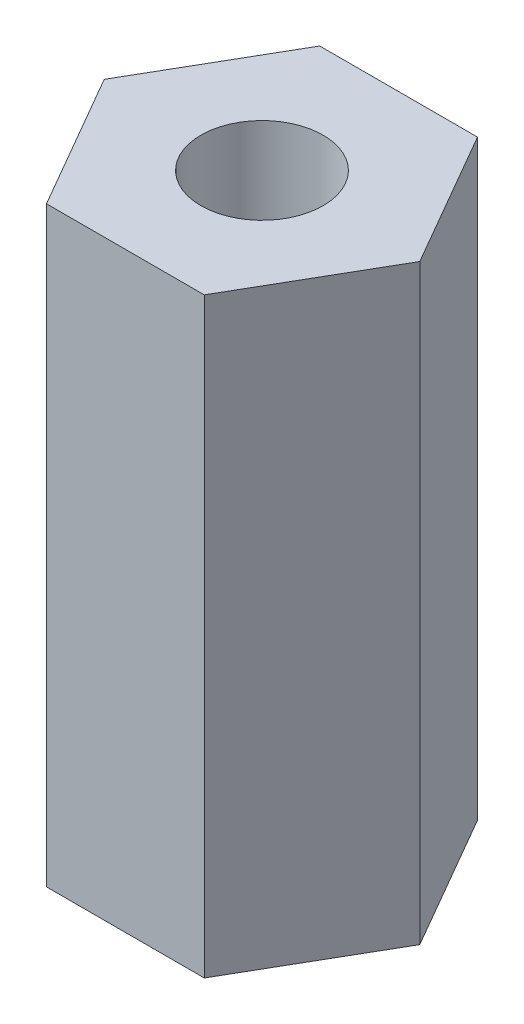
ISO-10303-21;
HEADER;
FILE_DESCRIPTION(('STEP AP214'),'2;1');
FILE_NAME('part.step','',(''),(''),'','','');
FILE_SCHEMA(('AUTOMOTIVE_DESIGN { 1 0 10303 214 1 1 1 1 }'));
ENDSEC;
DATA;
#1=APPLICATION_CONTEXT('core data for automotive mechanical design processes');
#2=APPLICATION_PROTOCOL_DEFINITION('international standard','automotive_design',2000,#1);
#3=PRODUCT_CONTEXT('',#1,'mechanical');
#4=PRODUCT('Part','Part','',(#3));
#5=PRODUCT_RELATED_PRODUCT_CATEGORY('part','',(#4));
#6=PRODUCT_DEFINITION_FORMATION('','',#4);
#7=PRODUCT_DEFINITION_CONTEXT('part definition',#1,'design');
#8=PRODUCT_DEFINITION('design','',#6,#7);
#9=PRODUCT_DEFINITION_SHAPE('','',#8);
#10=(LENGTH_UNIT() NAMED_UNIT(*) SI_UNIT(.MILLI.,.METRE.));
#11=(NAMED_UNIT(*) PLANE_ANGLE_UNIT() SI_UNIT($,.RADIAN.));
#12=(NAMED_UNIT(*) SI_UNIT($,.STERADIAN.) SOLID_ANGLE_UNIT());
#13=UNCERTAINTY_MEASURE_WITH_UNIT(LENGTH_MEASURE(1.E-05),#10,'distance_accuracy_value','');
#14=(GEOMETRIC_REPRESENTATION_CONTEXT(3) GLOBAL_UNCERTAINTY_ASSIGNED_CONTEXT((#13)) GLOBAL_UNIT_ASSIGNED_CONTEXT((#10,
#11,#12)) REPRESENTATION_CONTEXT('',''));
#15=CARTESIAN_POINT('',(0.,0.,0.));
#16=DIRECTION('',(0.,0.,1.));
#17=DIRECTION('',(1.,0.,0.));
#18=AXIS2_PLACEMENT_3D('',#15,#16,#17);
#19=CARTESIAN_POINT('',(0.,15.,0.));
#20=DIRECTION('',(0.,1.,0.));
#21=DIRECTION('',(0.,0.,1.));
#22=AXIS2_PLACEMENT_3D('',#19,#20,#21);
#23=PLANE('',#22);
#24=DIRECTION('',(-0.5,0.,-0.866025403784438));
#25=VECTOR('',#24,1.);
#26=CARTESIAN_POINT('',(4.,15.,0.));
#27=LINE('',#26,#25);
#28=CARTESIAN_POINT('',(4.,15.,0.));
#29=VERTEX_POINT('',#28);
#30=CARTESIAN_POINT('',(2.,15.,-3.46410161513775));
#31=VERTEX_POINT('',#30);
#32=EDGE_CURVE('E167',#29,#31,#27,.T.);
#33=ORIENTED_EDGE('',*,*,#32,.T.);
#34=DIRECTION('',(-1.,0.,0.));
#35=VECTOR('',#34,1.);
#36=CARTESIAN_POINT('',(2.,15.,-3.46410161513775));
#37=LINE('',#36,#35);
#38=CARTESIAN_POINT('',(-2.,15.,-3.46410161513776));
#39=VERTEX_POINT('',#38);
#40=EDGE_CURVE('E115',#31,#39,#37,.T.);
#41=ORIENTED_EDGE('',*,*,#40,.T.);
#42=DIRECTION('',(-0.5,0.,0.866025403784439));
#43=VECTOR('',#42,1.);
#44=CARTESIAN_POINT('',(-2.,15.,-3.46410161513776));
#45=LINE('',#44,#43);
#46=CARTESIAN_POINT('',(-4.,15.,0.));
#47=VERTEX_POINT('',#46);
#48=EDGE_CURVE('E128',#39,#47,#45,.T.);
#49=ORIENTED_EDGE('',*,*,#48,.T.);
#50=DIRECTION('',(0.5,0.,0.866025403784439));
#51=VECTOR('',#50,1.);
#52=CARTESIAN_POINT('',(-4.,15.,0.));
#53=LINE('',#52,#51);
#54=CARTESIAN_POINT('',(-2.,15.,3.46410161513775));
#55=VERTEX_POINT('',#54);
#56=EDGE_CURVE('E122',#47,#55,#53,.T.);
#57=ORIENTED_EDGE('',*,*,#56,.T.);
#58=DIRECTION('',(1.,0.,0.));
#59=VECTOR('',#58,1.);
#60=CARTESIAN_POINT('',(-2.,15.,3.46410161513775));
#61=LINE('',#60,#59);
#62=CARTESIAN_POINT('',(2.,15.,3.46410161513776));
#63=VERTEX_POINT('',#62);
#64=EDGE_CURVE('E126',#55,#63,#61,.T.);
#65=ORIENTED_EDGE('',*,*,#64,.T.);
#66=DIRECTION('',(0.5,0.,-0.866025403784439));
#67=VECTOR('',#66,1.);
#68=CARTESIAN_POINT('',(2.,15.,3.46410161513776));
#69=LINE('',#68,#67);
#70=EDGE_CURVE('E78',#63,#29,#69,.T.);
#71=ORIENTED_EDGE('',*,*,#70,.T.);
#72=EDGE_LOOP('',(#33,#41,#49,#57,#65,#71));
#73=FACE_BOUND('',#72,.T.);
#74=CARTESIAN_POINT('',(0.,15.,0.));
#75=DIRECTION('',(0.,1.,0.));
#76=DIRECTION('',(0.,0.,1.));
#77=AXIS2_PLACEMENT_3D('',#74,#75,#76);
#78=CIRCLE('',#77,1.55);
#79=CARTESIAN_POINT('',(0.,15.,1.55));
#80=VERTEX_POINT('',#79);
#81=EDGE_CURVE('E155',#80,#80,#78,.T.);
#82=ORIENTED_EDGE('',*,*,#81,.F.);
#83=EDGE_LOOP('',(#82));
#84=FACE_BOUND('',#83,.T.);
#85=ADVANCED_FACE('F60',(#73,#84),#23,.T.);
#86=CARTESIAN_POINT('',(0.,0.,0.));
#87=DIRECTION('',(0.,1.,0.));
#88=DIRECTION('',(0.,0.,1.));
#89=AXIS2_PLACEMENT_3D('',#86,#87,#88);
#90=PLANE('',#89);
#91=DIRECTION('',(-0.5,0.,-0.866025403784438));
#92=VECTOR('',#91,1.);
#93=CARTESIAN_POINT('',(4.,0.,0.));
#94=LINE('',#93,#92);
#95=CARTESIAN_POINT('',(4.,0.,0.));
#96=VERTEX_POINT('',#95);
#97=CARTESIAN_POINT('',(2.,0.,-3.46410161513775));
#98=VERTEX_POINT('',#97);
#99=EDGE_CURVE('E150',#96,#98,#94,.T.);
#100=ORIENTED_EDGE('',*,*,#99,.F.);
#101=DIRECTION('',(0.5,0.,-0.866025403784439));
#102=VECTOR('',#101,1.);
#103=CARTESIAN_POINT('',(2.,0.,3.46410161513776));
#104=LINE('',#103,#102);
#105=CARTESIAN_POINT('',(2.,0.,3.46410161513776));
#106=VERTEX_POINT('',#105);
#107=EDGE_CURVE('E107',#106,#96,#104,.T.);
#108=ORIENTED_EDGE('',*,*,#107,.F.);
#109=DIRECTION('',(1.,0.,0.));
#110=VECTOR('',#109,1.);
#111=CARTESIAN_POINT('',(-2.,0.,3.46410161513775));
#112=LINE('',#111,#110);
#113=CARTESIAN_POINT('',(-2.,0.,3.46410161513775));
#114=VERTEX_POINT('',#113);
#115=EDGE_CURVE('E101',#114,#106,#112,.T.);
#116=ORIENTED_EDGE('',*,*,#115,.F.);
#117=DIRECTION('',(0.5,0.,0.866025403784439));
#118=VECTOR('',#117,1.);
#119=CARTESIAN_POINT('',(-4.,0.,0.));
#120=LINE('',#119,#118);
#121=CARTESIAN_POINT('',(-4.,0.,0.));
#122=VERTEX_POINT('',#121);
#123=EDGE_CURVE('E137',#122,#114,#120,.T.);
#124=ORIENTED_EDGE('',*,*,#123,.F.);
#125=DIRECTION('',(-0.5,0.,0.866025403784439));
#126=VECTOR('',#125,1.);
#127=CARTESIAN_POINT('',(-2.,0.,-3.46410161513776));
#128=LINE('',#127,#126);
#129=CARTESIAN_POINT('',(-2.,0.,-3.46410161513776));
#130=VERTEX_POINT('',#129);
#131=EDGE_CURVE('E158',#130,#122,#128,.T.);
#132=ORIENTED_EDGE('',*,*,#131,.F.);
#133=DIRECTION('',(-1.,0.,0.));
#134=VECTOR('',#133,1.);
#135=CARTESIAN_POINT('',(2.,0.,-3.46410161513775));
#136=LINE('',#135,#134);
#137=EDGE_CURVE('E154',#98,#130,#136,.T.);
#138=ORIENTED_EDGE('',*,*,#137,.F.);
#139=EDGE_LOOP('',(#100,#108,#116,#124,#132,#138));
#140=FACE_BOUND('',#139,.T.);
#141=CARTESIAN_POINT('',(0.,0.,0.));
#142=DIRECTION('',(0.,1.,0.));
#143=DIRECTION('',(0.,0.,1.));
#144=AXIS2_PLACEMENT_3D('',#141,#142,#143);
#145=CIRCLE('',#144,1.55);
#146=CARTESIAN_POINT('',(0.,0.,1.55));
#147=VERTEX_POINT('',#146);
#148=EDGE_CURVE('E264',#147,#147,#145,.T.);
#149=ORIENTED_EDGE('',*,*,#148,.T.);
#150=EDGE_LOOP('',(#149));
#151=FACE_BOUND('',#150,.T.);
#152=ADVANCED_FACE('F180',(#140,#151),#90,.F.);
#153=CARTESIAN_POINT('',(4.,15.,0.));
#154=DIRECTION('',(-0.866025403784438,0.,0.5));
#155=DIRECTION('',(0.5,0.,0.866025403784439));
#156=AXIS2_PLACEMENT_3D('',#153,#154,#155);
#157=PLANE('',#156);
#158=ORIENTED_EDGE('',*,*,#99,.T.);
#159=DIRECTION('',(0.,-1.,0.));
#160=VECTOR('',#159,1.);
#161=CARTESIAN_POINT('',(2.,15.,-3.46410161513775));
#162=LINE('',#161,#160);
#163=EDGE_CURVE('E12',#31,#98,#162,.T.);
#164=ORIENTED_EDGE('',*,*,#163,.F.);
#165=ORIENTED_EDGE('',*,*,#32,.F.);
#166=DIRECTION('',(0.,-1.,0.));
#167=VECTOR('',#166,1.);
#168=CARTESIAN_POINT('',(4.,15.,0.));
#169=LINE('',#168,#167);
#170=EDGE_CURVE('E146',#29,#96,#169,.T.);
#171=ORIENTED_EDGE('',*,*,#170,.T.);
#172=EDGE_LOOP('',(#158,#164,#165,#171));
#173=FACE_BOUND('',#172,.T.);
#174=ADVANCED_FACE('F62',(#173),#157,.F.);
#175=CARTESIAN_POINT('',(2.,15.,-3.46410161513775));
#176=DIRECTION('',(0.,0.,1.));
#177=DIRECTION('',(1.,0.,0.));
#178=AXIS2_PLACEMENT_3D('',#175,#176,#177);
#179=PLANE('',#178);
#180=ORIENTED_EDGE('',*,*,#137,.T.);
#181=DIRECTION('',(0.,-1.,0.));
#182=VECTOR('',#181,1.);
#183=CARTESIAN_POINT('',(-2.,15.,-3.46410161513776));
#184=LINE('',#183,#182);
#185=EDGE_CURVE('E70',#39,#130,#184,.T.);
#186=ORIENTED_EDGE('',*,*,#185,.F.);
#187=ORIENTED_EDGE('',*,*,#40,.F.);
#188=ORIENTED_EDGE('',*,*,#163,.T.);
#189=EDGE_LOOP('',(#180,#186,#187,#188));
#190=FACE_BOUND('',#189,.T.);
#191=ADVANCED_FACE('F205',(#190),#179,.F.);
#192=CARTESIAN_POINT('',(-2.,15.,-3.46410161513776));
#193=DIRECTION('',(0.866025403784439,0.,0.5));
#194=DIRECTION('',(0.5,0.,-0.866025403784439));
#195=AXIS2_PLACEMENT_3D('',#192,#193,#194);
#196=PLANE('',#195);
#197=ORIENTED_EDGE('',*,*,#131,.T.);
#198=DIRECTION('',(0.,-1.,0.));
#199=VECTOR('',#198,1.);
#200=CARTESIAN_POINT('',(-4.,15.,0.));
#201=LINE('',#200,#199);
#202=EDGE_CURVE('E139',#47,#122,#201,.T.);
#203=ORIENTED_EDGE('',*,*,#202,.F.);
#204=ORIENTED_EDGE('',*,*,#48,.F.);
#205=ORIENTED_EDGE('',*,*,#185,.T.);
#206=EDGE_LOOP('',(#197,#203,#204,#205));
#207=FACE_BOUND('',#206,.T.);
#208=ADVANCED_FACE('F177',(#207),#196,.F.);
#209=CARTESIAN_POINT('',(-4.,15.,0.));
#210=DIRECTION('',(0.866025403784438,0.,-0.5));
#211=DIRECTION('',(-0.5,0.,-0.866025403784439));
#212=AXIS2_PLACEMENT_3D('',#209,#210,#211);
#213=PLANE('',#212);
#214=ORIENTED_EDGE('',*,*,#123,.T.);
#215=DIRECTION('',(0.,-1.,0.));
#216=VECTOR('',#215,1.);
#217=CARTESIAN_POINT('',(-2.,15.,3.46410161513775));
#218=LINE('',#217,#216);
#219=EDGE_CURVE('E134',#55,#114,#218,.T.);
#220=ORIENTED_EDGE('',*,*,#219,.F.);
#221=ORIENTED_EDGE('',*,*,#56,.F.);
#222=ORIENTED_EDGE('',*,*,#202,.T.);
#223=EDGE_LOOP('',(#214,#220,#221,#222));
#224=FACE_BOUND('',#223,.T.);
#225=ADVANCED_FACE('F135',(#224),#213,.F.);
#226=CARTESIAN_POINT('',(-2.,15.,3.46410161513775));
#227=DIRECTION('',(0.,0.,-1.));
#228=DIRECTION('',(-1.,0.,0.));
#229=AXIS2_PLACEMENT_3D('',#226,#227,#228);
#230=PLANE('',#229);
#231=ORIENTED_EDGE('',*,*,#115,.T.);
#232=DIRECTION('',(0.,-1.,0.));
#233=VECTOR('',#232,1.);
#234=CARTESIAN_POINT('',(2.,15.,3.46410161513776));
#235=LINE('',#234,#233);
#236=EDGE_CURVE('E140',#63,#106,#235,.T.);
#237=ORIENTED_EDGE('',*,*,#236,.F.);
#238=ORIENTED_EDGE('',*,*,#64,.F.);
#239=ORIENTED_EDGE('',*,*,#219,.T.);
#240=EDGE_LOOP('',(#231,#237,#238,#239));
#241=FACE_BOUND('',#240,.T.);
#242=ADVANCED_FACE('F142',(#241),#230,.F.);
#243=CARTESIAN_POINT('',(2.,15.,3.46410161513776));
#244=DIRECTION('',(-0.866025403784439,0.,-0.5));
#245=DIRECTION('',(-0.5,0.,0.866025403784439));
#246=AXIS2_PLACEMENT_3D('',#243,#244,#245);
#247=PLANE('',#246);
#248=ORIENTED_EDGE('',*,*,#107,.T.);
#249=ORIENTED_EDGE('',*,*,#170,.F.);
#250=ORIENTED_EDGE('',*,*,#70,.F.);
#251=ORIENTED_EDGE('',*,*,#236,.T.);
#252=EDGE_LOOP('',(#248,#249,#250,#251));
#253=FACE_BOUND('',#252,.T.);
#254=ADVANCED_FACE('F185',(#253),#247,.F.);
#255=CARTESIAN_POINT('',(0.,15.,0.));
#256=DIRECTION('',(0.,-1.,0.));
#257=DIRECTION('',(0.,0.,-1.));
#258=AXIS2_PLACEMENT_3D('',#255,#256,#257);
#259=CYLINDRICAL_SURFACE('',#258,1.55);
#260=ORIENTED_EDGE('',*,*,#81,.T.);
#261=EDGE_LOOP('',(#260));
#262=FACE_BOUND('',#261,.T.);
#263=ORIENTED_EDGE('',*,*,#148,.F.);
#264=EDGE_LOOP('',(#263));
#265=FACE_BOUND('',#264,.T.);
#266=ADVANCED_FACE('F187',(#262,#265),#259,.F.);
#267=CLOSED_SHELL('',(#85,#152,#174,#191,#208,#225,#242,#254,#266));
#268=MANIFOLD_SOLID_BREP('B2',#267);
#269=ADVANCED_BREP_SHAPE_REPRESENTATION('',(#18,#268),#14);
#270=SHAPE_DEFINITION_REPRESENTATION(#9,#269);
ENDSEC;
END-ISO-10303-21;
